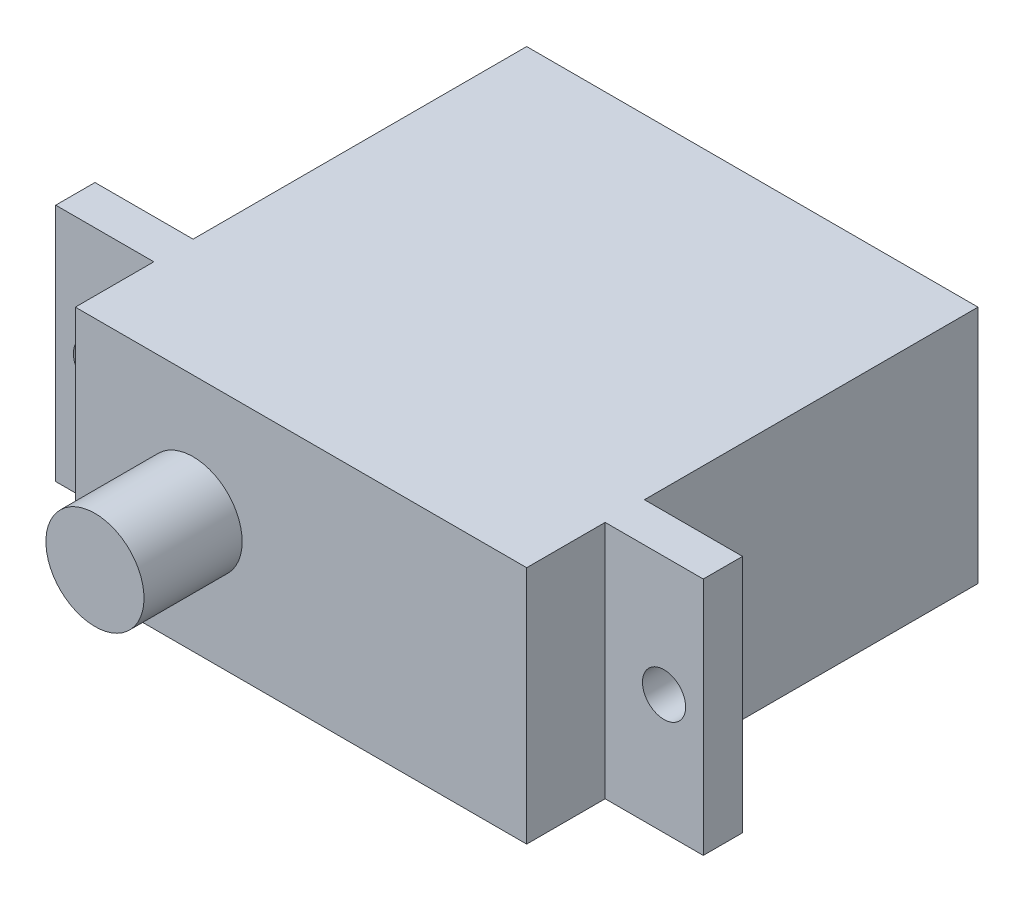
ISO-10303-21;
HEADER;
FILE_DESCRIPTION(('STEP AP214'),'2;1');
FILE_NAME('part.step','',(''),(''),'','','');
FILE_SCHEMA(('AUTOMOTIVE_DESIGN { 1 0 10303 214 1 1 1 1 }'));
ENDSEC;
DATA;
#1=APPLICATION_CONTEXT('core data for automotive mechanical design processes');
#2=APPLICATION_PROTOCOL_DEFINITION('international standard','automotive_design',2000,#1);
#3=PRODUCT_CONTEXT('',#1,'mechanical');
#4=PRODUCT('Part','Part','',(#3));
#5=PRODUCT_RELATED_PRODUCT_CATEGORY('part','',(#4));
#6=PRODUCT_DEFINITION_FORMATION('','',#4);
#7=PRODUCT_DEFINITION_CONTEXT('part definition',#1,'design');
#8=PRODUCT_DEFINITION('design','',#6,#7);
#9=PRODUCT_DEFINITION_SHAPE('','',#8);
#10=(LENGTH_UNIT() NAMED_UNIT(*) SI_UNIT(.MILLI.,.METRE.));
#11=(NAMED_UNIT(*) PLANE_ANGLE_UNIT() SI_UNIT($,.RADIAN.));
#12=(NAMED_UNIT(*) SI_UNIT($,.STERADIAN.) SOLID_ANGLE_UNIT());
#13=UNCERTAINTY_MEASURE_WITH_UNIT(LENGTH_MEASURE(1.E-05),#10,'distance_accuracy_value','');
#14=(GEOMETRIC_REPRESENTATION_CONTEXT(3) GLOBAL_UNCERTAINTY_ASSIGNED_CONTEXT((#13)) GLOBAL_UNIT_ASSIGNED_CONTEXT((#10,
#11,#12)) REPRESENTATION_CONTEXT('',''));
#15=CARTESIAN_POINT('',(0.,0.,0.));
#16=DIRECTION('',(0.,0.,1.));
#17=DIRECTION('',(1.,0.,0.));
#18=AXIS2_PLACEMENT_3D('',#15,#16,#17);
#19=CARTESIAN_POINT('',(-6.,-6.1,4.));
#20=DIRECTION('',(1.,0.,0.));
#21=DIRECTION('',(0.,0.,-1.));
#22=AXIS2_PLACEMENT_3D('',#19,#20,#21);
#23=PLANE('',#22);
#24=DIRECTION('',(0.,1.,0.));
#25=VECTOR('',#24,1.);
#26=CARTESIAN_POINT('',(-6.,-6.1,0.));
#27=LINE('',#26,#25);
#28=CARTESIAN_POINT('',(-6.,-6.1,0.));
#29=VERTEX_POINT('',#28);
#30=CARTESIAN_POINT('',(-6.,6.1,0.));
#31=VERTEX_POINT('',#30);
#32=EDGE_CURVE('E158',#29,#31,#27,.T.);
#33=ORIENTED_EDGE('',*,*,#32,.F.);
#34=DIRECTION('',(0.,0.,-1.));
#35=VECTOR('',#34,1.);
#36=CARTESIAN_POINT('',(-6.,-6.1,4.));
#37=LINE('',#36,#35);
#38=CARTESIAN_POINT('',(-6.,-6.1,4.));
#39=VERTEX_POINT('',#38);
#40=EDGE_CURVE('E139',#39,#29,#37,.T.);
#41=ORIENTED_EDGE('',*,*,#40,.F.);
#42=DIRECTION('',(0.,-1.,0.));
#43=VECTOR('',#42,1.);
#44=CARTESIAN_POINT('',(-6.,-6.1,4.));
#45=LINE('',#44,#43);
#46=CARTESIAN_POINT('',(-6.,6.1,4.));
#47=VERTEX_POINT('',#46);
#48=EDGE_CURVE('E166',#47,#39,#45,.T.);
#49=ORIENTED_EDGE('',*,*,#48,.F.);
#50=DIRECTION('',(0.,0.,-1.));
#51=VECTOR('',#50,1.);
#52=CARTESIAN_POINT('',(-6.,6.1,4.));
#53=LINE('',#52,#51);
#54=EDGE_CURVE('E186',#47,#31,#53,.T.);
#55=ORIENTED_EDGE('',*,*,#54,.T.);
#56=EDGE_LOOP('',(#33,#41,#49,#55));
#57=FACE_BOUND('',#56,.T.);
#58=ADVANCED_FACE('F39',(#57),#23,.F.);
#59=CARTESIAN_POINT('',(17.,-6.1,4.));
#60=DIRECTION('',(-1.,0.,0.));
#61=DIRECTION('',(0.,0.,1.));
#62=AXIS2_PLACEMENT_3D('',#59,#60,#61);
#63=PLANE('',#62);
#64=DIRECTION('',(0.,-1.,0.));
#65=VECTOR('',#64,1.);
#66=CARTESIAN_POINT('',(17.,-6.1,0.));
#67=LINE('',#66,#65);
#68=CARTESIAN_POINT('',(17.,6.1,0.));
#69=VERTEX_POINT('',#68);
#70=CARTESIAN_POINT('',(17.,-6.1,0.));
#71=VERTEX_POINT('',#70);
#72=EDGE_CURVE('E48',#69,#71,#67,.T.);
#73=ORIENTED_EDGE('',*,*,#72,.F.);
#74=DIRECTION('',(0.,0.,-1.));
#75=VECTOR('',#74,1.);
#76=CARTESIAN_POINT('',(17.,6.1,4.));
#77=LINE('',#76,#75);
#78=CARTESIAN_POINT('',(17.,6.1,4.));
#79=VERTEX_POINT('',#78);
#80=EDGE_CURVE('E194',#79,#69,#77,.T.);
#81=ORIENTED_EDGE('',*,*,#80,.F.);
#82=DIRECTION('',(0.,1.,0.));
#83=VECTOR('',#82,1.);
#84=CARTESIAN_POINT('',(17.,-6.1,4.));
#85=LINE('',#84,#83);
#86=CARTESIAN_POINT('',(17.,-6.1,4.));
#87=VERTEX_POINT('',#86);
#88=EDGE_CURVE('E172',#87,#79,#85,.T.);
#89=ORIENTED_EDGE('',*,*,#88,.F.);
#90=DIRECTION('',(0.,0.,-1.));
#91=VECTOR('',#90,1.);
#92=CARTESIAN_POINT('',(17.,-6.1,4.));
#93=LINE('',#92,#91);
#94=EDGE_CURVE('E200',#87,#71,#93,.T.);
#95=ORIENTED_EDGE('',*,*,#94,.T.);
#96=EDGE_LOOP('',(#73,#81,#89,#95));
#97=FACE_BOUND('',#96,.T.);
#98=ADVANCED_FACE('F271',(#97),#63,.F.);
#99=CARTESIAN_POINT('',(-6.,-6.1,-2.));
#100=VERTEX_POINT('',#99);
#101=CARTESIAN_POINT('',(-6.,-6.1,-19.));
#102=VERTEX_POINT('',#101);
#103=EDGE_CURVE('E199',#100,#102,#37,.T.);
#104=ORIENTED_EDGE('',*,*,#103,.F.);
#105=DIRECTION('',(0.,1.,0.));
#106=VECTOR('',#105,1.);
#107=CARTESIAN_POINT('',(-6.,-6.1,-2.));
#108=LINE('',#107,#106);
#109=CARTESIAN_POINT('',(-6.,6.1,-2.));
#110=VERTEX_POINT('',#109);
#111=EDGE_CURVE('E156',#100,#110,#108,.T.);
#112=ORIENTED_EDGE('',*,*,#111,.T.);
#113=CARTESIAN_POINT('',(-6.,6.1,-19.));
#114=VERTEX_POINT('',#113);
#115=EDGE_CURVE('E178',#110,#114,#53,.T.);
#116=ORIENTED_EDGE('',*,*,#115,.T.);
#117=DIRECTION('',(0.,-1.,0.));
#118=VECTOR('',#117,1.);
#119=CARTESIAN_POINT('',(-6.,-6.1,-19.));
#120=LINE('',#119,#118);
#121=EDGE_CURVE('E170',#114,#102,#120,.T.);
#122=ORIENTED_EDGE('',*,*,#121,.T.);
#123=EDGE_LOOP('',(#104,#112,#116,#122));
#124=FACE_BOUND('',#123,.T.);
#125=ADVANCED_FACE('F41',(#124),#23,.F.);
#126=CARTESIAN_POINT('',(-6.,-6.1,4.));
#127=DIRECTION('',(0.,1.,0.));
#128=DIRECTION('',(0.,0.,1.));
#129=AXIS2_PLACEMENT_3D('',#126,#127,#128);
#130=PLANE('',#129);
#131=ORIENTED_EDGE('',*,*,#40,.T.);
#132=DIRECTION('',(1.,0.,0.));
#133=VECTOR('',#132,1.);
#134=CARTESIAN_POINT('',(-11.,-6.1,0.));
#135=LINE('',#134,#133);
#136=CARTESIAN_POINT('',(-11.,-6.1,0.));
#137=VERTEX_POINT('',#136);
#138=EDGE_CURVE('E128',#137,#29,#135,.T.);
#139=ORIENTED_EDGE('',*,*,#138,.F.);
#140=DIRECTION('',(0.,0.,-1.));
#141=VECTOR('',#140,1.);
#142=CARTESIAN_POINT('',(-11.,-6.1,0.));
#143=LINE('',#142,#141);
#144=CARTESIAN_POINT('',(-11.,-6.1,-2.));
#145=VERTEX_POINT('',#144);
#146=EDGE_CURVE('E134',#137,#145,#143,.T.);
#147=ORIENTED_EDGE('',*,*,#146,.T.);
#148=DIRECTION('',(1.,0.,0.));
#149=VECTOR('',#148,1.);
#150=CARTESIAN_POINT('',(-11.,-6.1,-2.));
#151=LINE('',#150,#149);
#152=EDGE_CURVE('E228',#145,#100,#151,.T.);
#153=ORIENTED_EDGE('',*,*,#152,.T.);
#154=ORIENTED_EDGE('',*,*,#103,.T.);
#155=DIRECTION('',(1.,0.,0.));
#156=VECTOR('',#155,1.);
#157=CARTESIAN_POINT('',(-6.,-6.1,-19.));
#158=LINE('',#157,#156);
#159=CARTESIAN_POINT('',(17.,-6.1,-19.));
#160=VERTEX_POINT('',#159);
#161=EDGE_CURVE('E181',#102,#160,#158,.T.);
#162=ORIENTED_EDGE('',*,*,#161,.T.);
#163=CARTESIAN_POINT('',(17.,-6.1,-2.));
#164=VERTEX_POINT('',#163);
#165=EDGE_CURVE('E196',#164,#160,#93,.T.);
#166=ORIENTED_EDGE('',*,*,#165,.F.);
#167=CARTESIAN_POINT('',(22.,-6.1,-2.));
#168=VERTEX_POINT('',#167);
#169=EDGE_CURVE('E61',#164,#168,#151,.T.);
#170=ORIENTED_EDGE('',*,*,#169,.T.);
#171=DIRECTION('',(0.,0.,-1.));
#172=VECTOR('',#171,1.);
#173=CARTESIAN_POINT('',(22.,-6.1,0.));
#174=LINE('',#173,#172);
#175=CARTESIAN_POINT('',(22.,-6.1,0.));
#176=VERTEX_POINT('',#175);
#177=EDGE_CURVE('E157',#176,#168,#174,.T.);
#178=ORIENTED_EDGE('',*,*,#177,.F.);
#179=EDGE_CURVE('E145',#71,#176,#135,.T.);
#180=ORIENTED_EDGE('',*,*,#179,.F.);
#181=ORIENTED_EDGE('',*,*,#94,.F.);
#182=DIRECTION('',(1.,0.,0.));
#183=VECTOR('',#182,1.);
#184=CARTESIAN_POINT('',(-6.,-6.1,4.));
#185=LINE('',#184,#183);
#186=EDGE_CURVE('E171',#39,#87,#185,.T.);
#187=ORIENTED_EDGE('',*,*,#186,.F.);
#188=EDGE_LOOP('',(#131,#139,#147,#153,#154,#162,#166,#170,#178,#180,#181,#187));
#189=FACE_BOUND('',#188,.T.);
#190=ADVANCED_FACE('F135',(#189),#130,.F.);
#191=CARTESIAN_POINT('',(17.,6.1,-2.));
#192=VERTEX_POINT('',#191);
#193=CARTESIAN_POINT('',(17.,6.1,-19.));
#194=VERTEX_POINT('',#193);
#195=EDGE_CURVE('E195',#192,#194,#77,.T.);
#196=ORIENTED_EDGE('',*,*,#195,.F.);
#197=DIRECTION('',(0.,-1.,0.));
#198=VECTOR('',#197,1.);
#199=CARTESIAN_POINT('',(17.,-6.1,-2.));
#200=LINE('',#199,#198);
#201=EDGE_CURVE('E202',#192,#164,#200,.T.);
#202=ORIENTED_EDGE('',*,*,#201,.T.);
#203=ORIENTED_EDGE('',*,*,#165,.T.);
#204=DIRECTION('',(0.,1.,0.));
#205=VECTOR('',#204,1.);
#206=CARTESIAN_POINT('',(17.,-6.1,-19.));
#207=LINE('',#206,#205);
#208=EDGE_CURVE('E183',#160,#194,#207,.T.);
#209=ORIENTED_EDGE('',*,*,#208,.T.);
#210=EDGE_LOOP('',(#196,#202,#203,#209));
#211=FACE_BOUND('',#210,.T.);
#212=ADVANCED_FACE('F242',(#211),#63,.F.);
#213=CARTESIAN_POINT('',(-6.,6.1,4.));
#214=DIRECTION('',(0.,-1.,0.));
#215=DIRECTION('',(0.,0.,-1.));
#216=AXIS2_PLACEMENT_3D('',#213,#214,#215);
#217=PLANE('',#216);
#218=ORIENTED_EDGE('',*,*,#80,.T.);
#219=DIRECTION('',(-1.,0.,0.));
#220=VECTOR('',#219,1.);
#221=CARTESIAN_POINT('',(-11.,6.1,0.));
#222=LINE('',#221,#220);
#223=CARTESIAN_POINT('',(22.,6.1,0.));
#224=VERTEX_POINT('',#223);
#225=EDGE_CURVE('E222',#224,#69,#222,.T.);
#226=ORIENTED_EDGE('',*,*,#225,.F.);
#227=DIRECTION('',(0.,0.,-1.));
#228=VECTOR('',#227,1.);
#229=CARTESIAN_POINT('',(22.,6.1,0.));
#230=LINE('',#229,#228);
#231=CARTESIAN_POINT('',(22.,6.1,-2.));
#232=VERTEX_POINT('',#231);
#233=EDGE_CURVE('E162',#224,#232,#230,.T.);
#234=ORIENTED_EDGE('',*,*,#233,.T.);
#235=DIRECTION('',(-1.,0.,0.));
#236=VECTOR('',#235,1.);
#237=CARTESIAN_POINT('',(-11.,6.1,-2.));
#238=LINE('',#237,#236);
#239=EDGE_CURVE('E155',#232,#192,#238,.T.);
#240=ORIENTED_EDGE('',*,*,#239,.T.);
#241=ORIENTED_EDGE('',*,*,#195,.T.);
#242=DIRECTION('',(-1.,0.,0.));
#243=VECTOR('',#242,1.);
#244=CARTESIAN_POINT('',(-6.,6.1,-19.));
#245=LINE('',#244,#243);
#246=EDGE_CURVE('E175',#194,#114,#245,.T.);
#247=ORIENTED_EDGE('',*,*,#246,.T.);
#248=ORIENTED_EDGE('',*,*,#115,.F.);
#249=CARTESIAN_POINT('',(-11.,6.1,-2.));
#250=VERTEX_POINT('',#249);
#251=EDGE_CURVE('E57',#110,#250,#238,.T.);
#252=ORIENTED_EDGE('',*,*,#251,.T.);
#253=DIRECTION('',(0.,0.,-1.));
#254=VECTOR('',#253,1.);
#255=CARTESIAN_POINT('',(-11.,6.1,0.));
#256=LINE('',#255,#254);
#257=CARTESIAN_POINT('',(-11.,6.1,0.));
#258=VERTEX_POINT('',#257);
#259=EDGE_CURVE('E223',#258,#250,#256,.T.);
#260=ORIENTED_EDGE('',*,*,#259,.F.);
#261=EDGE_CURVE('E149',#31,#258,#222,.T.);
#262=ORIENTED_EDGE('',*,*,#261,.F.);
#263=ORIENTED_EDGE('',*,*,#54,.F.);
#264=DIRECTION('',(-1.,0.,0.));
#265=VECTOR('',#264,1.);
#266=CARTESIAN_POINT('',(-6.,6.1,4.));
#267=LINE('',#266,#265);
#268=EDGE_CURVE('E176',#79,#47,#267,.T.);
#269=ORIENTED_EDGE('',*,*,#268,.F.);
#270=EDGE_LOOP('',(#218,#226,#234,#240,#241,#247,#248,#252,#260,#262,#263,#269));
#271=FACE_BOUND('',#270,.T.);
#272=ADVANCED_FACE('F240',(#271),#217,.F.);
#273=CARTESIAN_POINT('',(0.,0.,4.));
#274=DIRECTION('',(0.,0.,-1.));
#275=DIRECTION('',(-1.,0.,0.));
#276=AXIS2_PLACEMENT_3D('',#273,#274,#275);
#277=PLANE('',#276);
#278=CARTESIAN_POINT('',(0.,0.,4.));
#279=DIRECTION('',(0.,0.,1.));
#280=DIRECTION('',(1.,0.,0.));
#281=AXIS2_PLACEMENT_3D('',#278,#279,#280);
#282=CIRCLE('',#281,2.5);
#283=CARTESIAN_POINT('',(2.5,0.,4.));
#284=VERTEX_POINT('',#283);
#285=EDGE_CURVE('E11',#284,#284,#282,.T.);
#286=ORIENTED_EDGE('',*,*,#285,.F.);
#287=EDGE_LOOP('',(#286));
#288=FACE_BOUND('',#287,.T.);
#289=ORIENTED_EDGE('',*,*,#48,.T.);
#290=ORIENTED_EDGE('',*,*,#186,.T.);
#291=ORIENTED_EDGE('',*,*,#88,.T.);
#292=ORIENTED_EDGE('',*,*,#268,.T.);
#293=EDGE_LOOP('',(#289,#290,#291,#292));
#294=FACE_BOUND('',#293,.T.);
#295=ADVANCED_FACE('F293',(#288,#294),#277,.F.);
#296=CARTESIAN_POINT('',(0.,0.,-19.));
#297=DIRECTION('',(0.,0.,-1.));
#298=DIRECTION('',(-1.,0.,0.));
#299=AXIS2_PLACEMENT_3D('',#296,#297,#298);
#300=PLANE('',#299);
#301=ORIENTED_EDGE('',*,*,#121,.F.);
#302=ORIENTED_EDGE('',*,*,#246,.F.);
#303=ORIENTED_EDGE('',*,*,#208,.F.);
#304=ORIENTED_EDGE('',*,*,#161,.F.);
#305=EDGE_LOOP('',(#301,#302,#303,#304));
#306=FACE_BOUND('',#305,.T.);
#307=ADVANCED_FACE('F255',(#306),#300,.T.);
#308=CARTESIAN_POINT('',(22.,-6.1,0.));
#309=DIRECTION('',(-1.,0.,0.));
#310=DIRECTION('',(0.,0.,1.));
#311=AXIS2_PLACEMENT_3D('',#308,#309,#310);
#312=PLANE('',#311);
#313=DIRECTION('',(0.,1.,0.));
#314=VECTOR('',#313,1.);
#315=CARTESIAN_POINT('',(22.,-6.1,-2.));
#316=LINE('',#315,#314);
#317=EDGE_CURVE('E226',#168,#232,#316,.T.);
#318=ORIENTED_EDGE('',*,*,#317,.T.);
#319=ORIENTED_EDGE('',*,*,#233,.F.);
#320=DIRECTION('',(0.,1.,0.));
#321=VECTOR('',#320,1.);
#322=CARTESIAN_POINT('',(22.,-6.1,0.));
#323=LINE('',#322,#321);
#324=EDGE_CURVE('E142',#176,#224,#323,.T.);
#325=ORIENTED_EDGE('',*,*,#324,.F.);
#326=ORIENTED_EDGE('',*,*,#177,.T.);
#327=EDGE_LOOP('',(#318,#319,#325,#326));
#328=FACE_BOUND('',#327,.T.);
#329=ADVANCED_FACE('F270',(#328),#312,.F.);
#330=CARTESIAN_POINT('',(0.,0.,-2.));
#331=DIRECTION('',(0.,0.,-1.));
#332=DIRECTION('',(-1.,0.,0.));
#333=AXIS2_PLACEMENT_3D('',#330,#331,#332);
#334=PLANE('',#333);
#335=CARTESIAN_POINT('',(20.,0.,-2.));
#336=DIRECTION('',(0.,0.,-1.));
#337=DIRECTION('',(-1.,0.,0.));
#338=AXIS2_PLACEMENT_3D('',#335,#336,#337);
#339=CIRCLE('',#338,1.1);
#340=CARTESIAN_POINT('',(18.9,0.,-2.));
#341=VERTEX_POINT('',#340);
#342=EDGE_CURVE('E211',#341,#341,#339,.F.);
#343=ORIENTED_EDGE('',*,*,#342,.T.);
#344=EDGE_LOOP('',(#343));
#345=FACE_BOUND('',#344,.T.);
#346=ORIENTED_EDGE('',*,*,#201,.F.);
#347=ORIENTED_EDGE('',*,*,#239,.F.);
#348=ORIENTED_EDGE('',*,*,#317,.F.);
#349=ORIENTED_EDGE('',*,*,#169,.F.);
#350=EDGE_LOOP('',(#346,#347,#348,#349));
#351=FACE_BOUND('',#350,.T.);
#352=ADVANCED_FACE('F241',(#345,#351),#334,.T.);
#353=CARTESIAN_POINT('',(0.,0.,0.));
#354=DIRECTION('',(0.,0.,-1.));
#355=DIRECTION('',(-1.,0.,0.));
#356=AXIS2_PLACEMENT_3D('',#353,#354,#355);
#357=PLANE('',#356);
#358=CARTESIAN_POINT('',(20.,0.,0.));
#359=DIRECTION('',(0.,0.,-1.));
#360=DIRECTION('',(-1.,0.,0.));
#361=AXIS2_PLACEMENT_3D('',#358,#359,#360);
#362=CIRCLE('',#361,1.1);
#363=CARTESIAN_POINT('',(18.9,0.,0.));
#364=VERTEX_POINT('',#363);
#365=EDGE_CURVE('E43',#364,#364,#362,.F.);
#366=ORIENTED_EDGE('',*,*,#365,.F.);
#367=EDGE_LOOP('',(#366));
#368=FACE_BOUND('',#367,.T.);
#369=ORIENTED_EDGE('',*,*,#225,.T.);
#370=ORIENTED_EDGE('',*,*,#72,.T.);
#371=ORIENTED_EDGE('',*,*,#179,.T.);
#372=ORIENTED_EDGE('',*,*,#324,.T.);
#373=EDGE_LOOP('',(#369,#370,#371,#372));
#374=FACE_BOUND('',#373,.T.);
#375=ADVANCED_FACE('F264',(#368,#374),#357,.F.);
#376=CARTESIAN_POINT('',(-9.,0.,0.));
#377=DIRECTION('',(0.,0.,-1.));
#378=DIRECTION('',(-1.,0.,0.));
#379=AXIS2_PLACEMENT_3D('',#376,#377,#378);
#380=CIRCLE('',#379,1.1);
#381=CARTESIAN_POINT('',(-10.1,0.,0.));
#382=VERTEX_POINT('',#381);
#383=EDGE_CURVE('E207',#382,#382,#380,.F.);
#384=ORIENTED_EDGE('',*,*,#383,.F.);
#385=EDGE_LOOP('',(#384));
#386=FACE_BOUND('',#385,.T.);
#387=ORIENTED_EDGE('',*,*,#138,.T.);
#388=ORIENTED_EDGE('',*,*,#32,.T.);
#389=ORIENTED_EDGE('',*,*,#261,.T.);
#390=DIRECTION('',(0.,-1.,0.));
#391=VECTOR('',#390,1.);
#392=CARTESIAN_POINT('',(-11.,-6.1,0.));
#393=LINE('',#392,#391);
#394=EDGE_CURVE('E143',#258,#137,#393,.T.);
#395=ORIENTED_EDGE('',*,*,#394,.T.);
#396=EDGE_LOOP('',(#387,#388,#389,#395));
#397=FACE_BOUND('',#396,.T.);
#398=ADVANCED_FACE('F147',(#386,#397),#357,.F.);
#399=CARTESIAN_POINT('',(-9.,0.,-2.));
#400=DIRECTION('',(0.,0.,-1.));
#401=DIRECTION('',(-1.,0.,0.));
#402=AXIS2_PLACEMENT_3D('',#399,#400,#401);
#403=CIRCLE('',#402,1.1);
#404=CARTESIAN_POINT('',(-10.1,0.,-2.));
#405=VERTEX_POINT('',#404);
#406=EDGE_CURVE('E203',#405,#405,#403,.F.);
#407=ORIENTED_EDGE('',*,*,#406,.T.);
#408=EDGE_LOOP('',(#407));
#409=FACE_BOUND('',#408,.T.);
#410=ORIENTED_EDGE('',*,*,#111,.F.);
#411=ORIENTED_EDGE('',*,*,#152,.F.);
#412=DIRECTION('',(0.,-1.,0.));
#413=VECTOR('',#412,1.);
#414=CARTESIAN_POINT('',(-11.,-6.1,-2.));
#415=LINE('',#414,#413);
#416=EDGE_CURVE('E154',#250,#145,#415,.T.);
#417=ORIENTED_EDGE('',*,*,#416,.F.);
#418=ORIENTED_EDGE('',*,*,#251,.F.);
#419=EDGE_LOOP('',(#410,#411,#417,#418));
#420=FACE_BOUND('',#419,.T.);
#421=ADVANCED_FACE('F253',(#409,#420),#334,.T.);
#422=CARTESIAN_POINT('',(-11.,-6.1,0.));
#423=DIRECTION('',(1.,0.,0.));
#424=DIRECTION('',(0.,0.,-1.));
#425=AXIS2_PLACEMENT_3D('',#422,#423,#424);
#426=PLANE('',#425);
#427=ORIENTED_EDGE('',*,*,#416,.T.);
#428=ORIENTED_EDGE('',*,*,#146,.F.);
#429=ORIENTED_EDGE('',*,*,#394,.F.);
#430=ORIENTED_EDGE('',*,*,#259,.T.);
#431=EDGE_LOOP('',(#427,#428,#429,#430));
#432=FACE_BOUND('',#431,.T.);
#433=ADVANCED_FACE('F153',(#432),#426,.F.);
#434=CARTESIAN_POINT('',(0.,0.,9.));
#435=DIRECTION('',(0.,0.,-1.));
#436=DIRECTION('',(-1.,0.,0.));
#437=AXIS2_PLACEMENT_3D('',#434,#435,#436);
#438=CYLINDRICAL_SURFACE('',#437,2.5);
#439=CARTESIAN_POINT('',(0.,0.,9.));
#440=DIRECTION('',(0.,0.,1.));
#441=DIRECTION('',(1.,0.,0.));
#442=AXIS2_PLACEMENT_3D('',#439,#440,#441);
#443=CIRCLE('',#442,2.5);
#444=CARTESIAN_POINT('',(2.5,0.,9.));
#445=VERTEX_POINT('',#444);
#446=EDGE_CURVE('E217',#445,#445,#443,.T.);
#447=ORIENTED_EDGE('',*,*,#446,.F.);
#448=EDGE_LOOP('',(#447));
#449=FACE_BOUND('',#448,.T.);
#450=ORIENTED_EDGE('',*,*,#285,.T.);
#451=EDGE_LOOP('',(#450));
#452=FACE_BOUND('',#451,.T.);
#453=ADVANCED_FACE('F262',(#449,#452),#438,.T.);
#454=CARTESIAN_POINT('',(0.,0.,9.));
#455=DIRECTION('',(0.,0.,1.));
#456=DIRECTION('',(1.,0.,0.));
#457=AXIS2_PLACEMENT_3D('',#454,#455,#456);
#458=PLANE('',#457);
#459=ORIENTED_EDGE('',*,*,#446,.T.);
#460=EDGE_LOOP('',(#459));
#461=FACE_BOUND('',#460,.T.);
#462=ADVANCED_FACE('F317',(#461),#458,.T.);
#463=CARTESIAN_POINT('',(-9.,0.,9.));
#464=DIRECTION('',(0.,0.,-1.));
#465=DIRECTION('',(-1.,0.,0.));
#466=AXIS2_PLACEMENT_3D('',#463,#464,#465);
#467=CYLINDRICAL_SURFACE('',#466,1.1);
#468=CARTESIAN_POINT('',(-10.1,0.,-2.));
#469=CARTESIAN_POINT('',(-10.1,0.,-1.97916666666667));
#470=CARTESIAN_POINT('',(-10.1,0.,-1.95833333333333));
#471=CARTESIAN_POINT('',(-10.1,0.,-1.91666666666667));
#472=CARTESIAN_POINT('',(-10.1,0.,-1.89583333333333));
#473=CARTESIAN_POINT('',(-10.1,0.,-1.85416666666667));
#474=CARTESIAN_POINT('',(-10.1,0.,-1.83333333333333));
#475=CARTESIAN_POINT('',(-10.1,0.,-1.79166666666667));
#476=CARTESIAN_POINT('',(-10.1,0.,-1.77083333333333));
#477=CARTESIAN_POINT('',(-10.1,0.,-1.72916666666667));
#478=CARTESIAN_POINT('',(-10.1,0.,-1.70833333333333));
#479=CARTESIAN_POINT('',(-10.1,0.,-1.66666666666667));
#480=CARTESIAN_POINT('',(-10.1,0.,-1.64583333333333));
#481=CARTESIAN_POINT('',(-10.1,0.,-1.60416666666667));
#482=CARTESIAN_POINT('',(-10.1,0.,-1.58333333333333));
#483=CARTESIAN_POINT('',(-10.1,0.,-1.54166666666667));
#484=CARTESIAN_POINT('',(-10.1,0.,-1.52083333333333));
#485=CARTESIAN_POINT('',(-10.1,0.,-1.47916666666667));
#486=CARTESIAN_POINT('',(-10.1,0.,-1.45833333333333));
#487=CARTESIAN_POINT('',(-10.1,0.,-1.41666666666667));
#488=CARTESIAN_POINT('',(-10.1,0.,-1.39583333333333));
#489=CARTESIAN_POINT('',(-10.1,0.,-1.35416666666667));
#490=CARTESIAN_POINT('',(-10.1,0.,-1.33333333333333));
#491=CARTESIAN_POINT('',(-10.1,0.,-1.29166666666667));
#492=CARTESIAN_POINT('',(-10.1,0.,-1.27083333333333));
#493=CARTESIAN_POINT('',(-10.1,0.,-1.22916666666667));
#494=CARTESIAN_POINT('',(-10.1,0.,-1.20833333333333));
#495=CARTESIAN_POINT('',(-10.1,0.,-1.16666666666667));
#496=CARTESIAN_POINT('',(-10.1,0.,-1.14583333333333));
#497=CARTESIAN_POINT('',(-10.1,0.,-1.10416666666667));
#498=CARTESIAN_POINT('',(-10.1,0.,-1.08333333333333));
#499=CARTESIAN_POINT('',(-10.1,0.,-1.04166666666667));
#500=CARTESIAN_POINT('',(-10.1,0.,-1.02083333333333));
#501=CARTESIAN_POINT('',(-10.1,0.,-0.979166666666666));
#502=CARTESIAN_POINT('',(-10.1,0.,-0.958333333333332));
#503=CARTESIAN_POINT('',(-10.1,0.,-0.916666666666666));
#504=CARTESIAN_POINT('',(-10.1,0.,-0.895833333333332));
#505=CARTESIAN_POINT('',(-10.1,0.,-0.854166666666666));
#506=CARTESIAN_POINT('',(-10.1,0.,-0.833333333333332));
#507=CARTESIAN_POINT('',(-10.1,0.,-0.791666666666666));
#508=CARTESIAN_POINT('',(-10.1,0.,-0.770833333333332));
#509=CARTESIAN_POINT('',(-10.1,0.,-0.729166666666666));
#510=CARTESIAN_POINT('',(-10.1,0.,-0.708333333333332));
#511=CARTESIAN_POINT('',(-10.1,0.,-0.666666666666666));
#512=CARTESIAN_POINT('',(-10.1,0.,-0.645833333333332));
#513=CARTESIAN_POINT('',(-10.1,0.,-0.604166666666666));
#514=CARTESIAN_POINT('',(-10.1,0.,-0.583333333333332));
#515=CARTESIAN_POINT('',(-10.1,0.,-0.541666666666665));
#516=CARTESIAN_POINT('',(-10.1,0.,-0.520833333333332));
#517=CARTESIAN_POINT('',(-10.1,0.,-0.479166666666665));
#518=CARTESIAN_POINT('',(-10.1,0.,-0.458333333333332));
#519=CARTESIAN_POINT('',(-10.1,0.,-0.416666666666665));
#520=CARTESIAN_POINT('',(-10.1,0.,-0.395833333333332));
#521=CARTESIAN_POINT('',(-10.1,0.,-0.354166666666665));
#522=CARTESIAN_POINT('',(-10.1,0.,-0.333333333333332));
#523=CARTESIAN_POINT('',(-10.1,0.,-0.291666666666665));
#524=CARTESIAN_POINT('',(-10.1,0.,-0.270833333333332));
#525=CARTESIAN_POINT('',(-10.1,0.,-0.229166666666665));
#526=CARTESIAN_POINT('',(-10.1,0.,-0.208333333333332));
#527=CARTESIAN_POINT('',(-10.1,0.,-0.166666666666665));
#528=CARTESIAN_POINT('',(-10.1,0.,-0.145833333333332));
#529=CARTESIAN_POINT('',(-10.1,0.,-0.104166666666665));
#530=CARTESIAN_POINT('',(-10.1,0.,-0.0833333333333317));
#531=CARTESIAN_POINT('',(-10.1,0.,-0.041666666666665));
#532=CARTESIAN_POINT('',(-10.1,0.,-0.0208333333333316));
#533=CARTESIAN_POINT('',(-10.1,0.,0.));
#534=B_SPLINE_CURVE_WITH_KNOTS('',3,(#468,#469,#470,#471,#472,#473,#474,#475,#476,#477,#478,
#479,#480,#481,#482,#483,#484,#485,#486,#487,#488,#489,#490,#491,#492,#493,#494,#495,#496,#497,
#498,#499,#500,#501,#502,#503,#504,#505,#506,#507,#508,#509,#510,#511,#512,#513,#514,#515,#516,
#517,#518,#519,#520,#521,#522,#523,#524,#525,#526,#527,#528,#529,#530,#531,#532,#533),
.UNSPECIFIED.,.F.,.F.,(4,2,2,2,2,2,2,2,2,2,2,2,2,2,2,2,2,2,2,2,2,2,2,2,2,2,2,2,2,2,2,2,4),(0.,
0.0625000000000001,0.125,0.1875,0.25,0.3125,0.375,0.4375,0.5,0.5625,0.625000000000001,
0.687500000000001,0.750000000000001,0.812500000000001,0.875000000000001,0.937500000000001,1.,
1.0625,1.125,1.1875,1.25,1.3125,1.375,1.4375,1.5,1.5625,1.625,1.6875,1.75,1.8125,1.875,1.9375,
2.),.UNSPECIFIED.);
#535=EDGE_CURVE('BSEAM318',#405,#382,#534,.T.);
#536=ORIENTED_EDGE('',*,*,#406,.F.);
#537=ORIENTED_EDGE('',*,*,#383,.T.);
#538=ORIENTED_EDGE('',*,*,#535,.T.);
#539=ORIENTED_EDGE('',*,*,#535,.F.);
#540=EDGE_LOOP('',(#536,#538,#537,#539));
#541=FACE_BOUND('',#540,.T.);
#542=ADVANCED_FACE('F318',(#541),#467,.F.);
#543=CARTESIAN_POINT('',(20.,0.,9.));
#544=DIRECTION('',(0.,0.,-1.));
#545=DIRECTION('',(-1.,0.,0.));
#546=AXIS2_PLACEMENT_3D('',#543,#544,#545);
#547=CYLINDRICAL_SURFACE('',#546,1.1);
#548=CARTESIAN_POINT('',(18.9,0.,-2.));
#549=CARTESIAN_POINT('',(18.9,0.,-1.97916666666667));
#550=CARTESIAN_POINT('',(18.9,0.,-1.95833333333333));
#551=CARTESIAN_POINT('',(18.9,0.,-1.91666666666667));
#552=CARTESIAN_POINT('',(18.9,0.,-1.89583333333333));
#553=CARTESIAN_POINT('',(18.9,0.,-1.85416666666667));
#554=CARTESIAN_POINT('',(18.9,0.,-1.83333333333333));
#555=CARTESIAN_POINT('',(18.9,0.,-1.79166666666667));
#556=CARTESIAN_POINT('',(18.9,0.,-1.77083333333333));
#557=CARTESIAN_POINT('',(18.9,0.,-1.72916666666667));
#558=CARTESIAN_POINT('',(18.9,0.,-1.70833333333333));
#559=CARTESIAN_POINT('',(18.9,0.,-1.66666666666667));
#560=CARTESIAN_POINT('',(18.9,0.,-1.64583333333333));
#561=CARTESIAN_POINT('',(18.9,0.,-1.60416666666667));
#562=CARTESIAN_POINT('',(18.9,0.,-1.58333333333333));
#563=CARTESIAN_POINT('',(18.9,0.,-1.54166666666667));
#564=CARTESIAN_POINT('',(18.9,0.,-1.52083333333333));
#565=CARTESIAN_POINT('',(18.9,0.,-1.47916666666667));
#566=CARTESIAN_POINT('',(18.9,0.,-1.45833333333333));
#567=CARTESIAN_POINT('',(18.9,0.,-1.41666666666667));
#568=CARTESIAN_POINT('',(18.9,0.,-1.39583333333333));
#569=CARTESIAN_POINT('',(18.9,0.,-1.35416666666667));
#570=CARTESIAN_POINT('',(18.9,0.,-1.33333333333333));
#571=CARTESIAN_POINT('',(18.9,0.,-1.29166666666667));
#572=CARTESIAN_POINT('',(18.9,0.,-1.27083333333333));
#573=CARTESIAN_POINT('',(18.9,0.,-1.22916666666667));
#574=CARTESIAN_POINT('',(18.9,0.,-1.20833333333333));
#575=CARTESIAN_POINT('',(18.9,0.,-1.16666666666667));
#576=CARTESIAN_POINT('',(18.9,0.,-1.14583333333333));
#577=CARTESIAN_POINT('',(18.9,0.,-1.10416666666667));
#578=CARTESIAN_POINT('',(18.9,0.,-1.08333333333333));
#579=CARTESIAN_POINT('',(18.9,0.,-1.04166666666667));
#580=CARTESIAN_POINT('',(18.9,0.,-1.02083333333333));
#581=CARTESIAN_POINT('',(18.9,0.,-0.979166666666666));
#582=CARTESIAN_POINT('',(18.9,0.,-0.958333333333332));
#583=CARTESIAN_POINT('',(18.9,0.,-0.916666666666666));
#584=CARTESIAN_POINT('',(18.9,0.,-0.895833333333332));
#585=CARTESIAN_POINT('',(18.9,0.,-0.854166666666666));
#586=CARTESIAN_POINT('',(18.9,0.,-0.833333333333332));
#587=CARTESIAN_POINT('',(18.9,0.,-0.791666666666666));
#588=CARTESIAN_POINT('',(18.9,0.,-0.770833333333332));
#589=CARTESIAN_POINT('',(18.9,0.,-0.729166666666666));
#590=CARTESIAN_POINT('',(18.9,0.,-0.708333333333332));
#591=CARTESIAN_POINT('',(18.9,0.,-0.666666666666666));
#592=CARTESIAN_POINT('',(18.9,0.,-0.645833333333332));
#593=CARTESIAN_POINT('',(18.9,0.,-0.604166666666666));
#594=CARTESIAN_POINT('',(18.9,0.,-0.583333333333332));
#595=CARTESIAN_POINT('',(18.9,0.,-0.541666666666665));
#596=CARTESIAN_POINT('',(18.9,0.,-0.520833333333332));
#597=CARTESIAN_POINT('',(18.9,0.,-0.479166666666665));
#598=CARTESIAN_POINT('',(18.9,0.,-0.458333333333332));
#599=CARTESIAN_POINT('',(18.9,0.,-0.416666666666665));
#600=CARTESIAN_POINT('',(18.9,0.,-0.395833333333332));
#601=CARTESIAN_POINT('',(18.9,0.,-0.354166666666665));
#602=CARTESIAN_POINT('',(18.9,0.,-0.333333333333332));
#603=CARTESIAN_POINT('',(18.9,0.,-0.291666666666665));
#604=CARTESIAN_POINT('',(18.9,0.,-0.270833333333332));
#605=CARTESIAN_POINT('',(18.9,0.,-0.229166666666665));
#606=CARTESIAN_POINT('',(18.9,0.,-0.208333333333332));
#607=CARTESIAN_POINT('',(18.9,0.,-0.166666666666665));
#608=CARTESIAN_POINT('',(18.9,0.,-0.145833333333332));
#609=CARTESIAN_POINT('',(18.9,0.,-0.104166666666665));
#610=CARTESIAN_POINT('',(18.9,0.,-0.0833333333333317));
#611=CARTESIAN_POINT('',(18.9,0.,-0.041666666666665));
#612=CARTESIAN_POINT('',(18.9,0.,-0.0208333333333316));
#613=CARTESIAN_POINT('',(18.9,0.,0.));
#614=B_SPLINE_CURVE_WITH_KNOTS('',3,(#548,#549,#550,#551,#552,#553,#554,#555,#556,#557,#558,
#559,#560,#561,#562,#563,#564,#565,#566,#567,#568,#569,#570,#571,#572,#573,#574,#575,#576,#577,
#578,#579,#580,#581,#582,#583,#584,#585,#586,#587,#588,#589,#590,#591,#592,#593,#594,#595,#596,
#597,#598,#599,#600,#601,#602,#603,#604,#605,#606,#607,#608,#609,#610,#611,#612,#613),
.UNSPECIFIED.,.F.,.F.,(4,2,2,2,2,2,2,2,2,2,2,2,2,2,2,2,2,2,2,2,2,2,2,2,2,2,2,2,2,2,2,2,4),(0.,
0.0625000000000001,0.125,0.1875,0.25,0.3125,0.375,0.4375,0.5,0.5625,0.625000000000001,
0.687500000000001,0.750000000000001,0.812500000000001,0.875000000000001,0.937500000000001,1.,
1.0625,1.125,1.1875,1.25,1.3125,1.375,1.4375,1.5,1.5625,1.625,1.6875,1.75,1.8125,1.875,1.9375,
2.),.UNSPECIFIED.);
#615=EDGE_CURVE('BSEAM325',#341,#364,#614,.T.);
#616=ORIENTED_EDGE('',*,*,#342,.F.);
#617=ORIENTED_EDGE('',*,*,#365,.T.);
#618=ORIENTED_EDGE('',*,*,#615,.T.);
#619=ORIENTED_EDGE('',*,*,#615,.F.);
#620=EDGE_LOOP('',(#616,#618,#617,#619));
#621=FACE_BOUND('',#620,.T.);
#622=ADVANCED_FACE('F325',(#621),#547,.F.);
#623=CLOSED_SHELL('',(#58,#98,#125,#190,#212,#272,#295,#307,#329,#352,#375,#398,#421,#433,#453,
#462,#542,#622));
#624=MANIFOLD_SOLID_BREP('B2',#623);
#625=ADVANCED_BREP_SHAPE_REPRESENTATION('',(#18,#624),#14);
#626=SHAPE_DEFINITION_REPRESENTATION(#9,#625);
ENDSEC;
END-ISO-10303-21;
